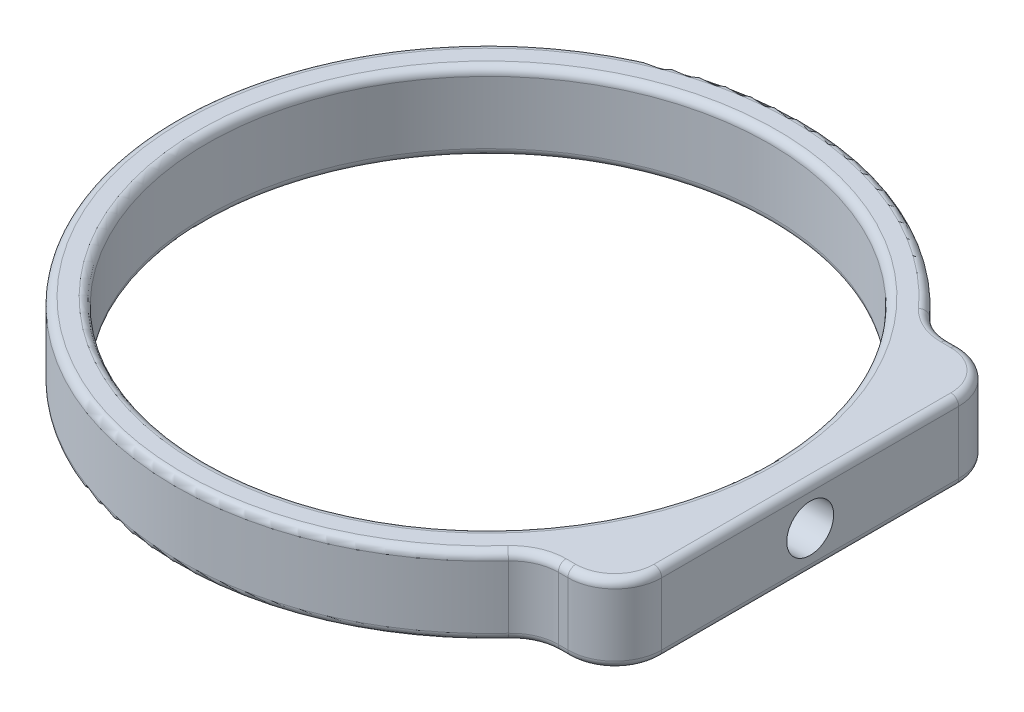
ISO-10303-21;
HEADER;
FILE_DESCRIPTION(('STEP AP214'),'2;1');
FILE_NAME('part.step','',(''),(''),'','','');
FILE_SCHEMA(('AUTOMOTIVE_DESIGN { 1 0 10303 214 1 1 1 1 }'));
ENDSEC;
DATA;
#1=APPLICATION_CONTEXT('core data for automotive mechanical design processes');
#2=APPLICATION_PROTOCOL_DEFINITION('international standard','automotive_design',2000,#1);
#3=PRODUCT_CONTEXT('',#1,'mechanical');
#4=PRODUCT('Part','Part','',(#3));
#5=PRODUCT_RELATED_PRODUCT_CATEGORY('part','',(#4));
#6=PRODUCT_DEFINITION_FORMATION('','',#4);
#7=PRODUCT_DEFINITION_CONTEXT('part definition',#1,'design');
#8=PRODUCT_DEFINITION('design','',#6,#7);
#9=PRODUCT_DEFINITION_SHAPE('','',#8);
#10=(LENGTH_UNIT() NAMED_UNIT(*) SI_UNIT(.MILLI.,.METRE.));
#11=(NAMED_UNIT(*) PLANE_ANGLE_UNIT() SI_UNIT($,.RADIAN.));
#12=(NAMED_UNIT(*) SI_UNIT($,.STERADIAN.) SOLID_ANGLE_UNIT());
#13=UNCERTAINTY_MEASURE_WITH_UNIT(LENGTH_MEASURE(1.E-05),#10,'distance_accuracy_value','');
#14=(GEOMETRIC_REPRESENTATION_CONTEXT(3) GLOBAL_UNCERTAINTY_ASSIGNED_CONTEXT((#13)) GLOBAL_UNIT_ASSIGNED_CONTEXT((#10,
#11,#12)) REPRESENTATION_CONTEXT('',''));
#15=CARTESIAN_POINT('',(0.,0.,0.));
#16=DIRECTION('',(0.,0.,1.));
#17=DIRECTION('',(1.,0.,0.));
#18=AXIS2_PLACEMENT_3D('',#15,#16,#17);
#19=CARTESIAN_POINT('',(0.,2.5,0.));
#20=DIRECTION('',(0.,1.,0.));
#21=DIRECTION('',(0.,0.,1.));
#22=AXIS2_PLACEMENT_3D('',#19,#20,#21);
#23=PLANE('',#22);
#24=CARTESIAN_POINT('',(0.,2.5,0.));
#25=DIRECTION('',(0.,1.,0.));
#26=DIRECTION('',(0.,0.,1.));
#27=AXIS2_PLACEMENT_3D('',#24,#25,#26);
#28=CIRCLE('',#27,9.25);
#29=CARTESIAN_POINT('',(0.,2.5,9.25));
#30=VERTEX_POINT('',#29);
#31=EDGE_CURVE('E11',#30,#30,#28,.F.);
#32=ORIENTED_EDGE('',*,*,#31,.T.);
#33=EDGE_LOOP('',(#32));
#34=FACE_BOUND('',#33,.T.);
#35=CARTESIAN_POINT('',(0.,2.5,0.));
#36=DIRECTION('',(0.,1.,0.));
#37=DIRECTION('',(0.,0.,1.));
#38=AXIS2_PLACEMENT_3D('',#35,#36,#37);
#39=CIRCLE('',#38,9.75);
#40=CARTESIAN_POINT('',(7.20340405707272,2.5,-6.57065217391304));
#41=VERTEX_POINT('',#40);
#42=CARTESIAN_POINT('',(7.20340405707272,2.5,6.57065217391304));
#43=VERTEX_POINT('',#42);
#44=EDGE_CURVE('E51',#41,#43,#39,.T.);
#45=ORIENTED_EDGE('',*,*,#44,.T.);
#46=CARTESIAN_POINT('',(8.49632273398321,2.5,7.75));
#47=DIRECTION('',(0.,1.,0.));
#48=DIRECTION('',(0.,0.,1.));
#49=AXIS2_PLACEMENT_3D('',#46,#47,#48);
#50=CIRCLE('',#49,1.75);
#51=CARTESIAN_POINT('',(8.49632273398321,2.5,6.));
#52=VERTEX_POINT('',#51);
#53=EDGE_CURVE('E43',#43,#52,#50,.F.);
#54=ORIENTED_EDGE('',*,*,#53,.T.);
#55=DIRECTION('',(1.,0.,0.));
#56=VECTOR('',#55,1.);
#57=CARTESIAN_POINT('',(8.806247497998,2.5,6.));
#58=LINE('',#57,#56);
#59=CARTESIAN_POINT('',(8.806247497998,2.5,6.));
#60=VERTEX_POINT('',#59);
#61=EDGE_CURVE('E221',#52,#60,#58,.T.);
#62=ORIENTED_EDGE('',*,*,#61,.T.);
#63=CARTESIAN_POINT('',(8.806247497998,2.5,4.75));
#64=DIRECTION('',(0.,1.,0.));
#65=DIRECTION('',(0.,0.,1.));
#66=AXIS2_PLACEMENT_3D('',#63,#64,#65);
#67=CIRCLE('',#66,1.25);
#68=CARTESIAN_POINT('',(10.056247497998,2.5,4.75));
#69=VERTEX_POINT('',#68);
#70=EDGE_CURVE('E223',#60,#69,#67,.T.);
#71=ORIENTED_EDGE('',*,*,#70,.T.);
#72=DIRECTION('',(0.,0.,-1.));
#73=VECTOR('',#72,1.);
#74=CARTESIAN_POINT('',(10.056247497998,2.5,-4.75));
#75=LINE('',#74,#73);
#76=CARTESIAN_POINT('',(10.056247497998,2.5,-4.75));
#77=VERTEX_POINT('',#76);
#78=EDGE_CURVE('E225',#69,#77,#75,.T.);
#79=ORIENTED_EDGE('',*,*,#78,.T.);
#80=CARTESIAN_POINT('',(8.806247497998,2.5,-4.75));
#81=DIRECTION('',(0.,1.,0.));
#82=DIRECTION('',(0.,0.,1.));
#83=AXIS2_PLACEMENT_3D('',#80,#81,#82);
#84=CIRCLE('',#83,1.25);
#85=CARTESIAN_POINT('',(8.806247497998,2.5,-6.));
#86=VERTEX_POINT('',#85);
#87=EDGE_CURVE('E227',#77,#86,#84,.T.);
#88=ORIENTED_EDGE('',*,*,#87,.T.);
#89=DIRECTION('',(-1.,0.,0.));
#90=VECTOR('',#89,1.);
#91=CARTESIAN_POINT('',(8.49632273398321,2.5,-6.));
#92=LINE('',#91,#90);
#93=CARTESIAN_POINT('',(8.49632273398321,2.5,-6.));
#94=VERTEX_POINT('',#93);
#95=EDGE_CURVE('E229',#86,#94,#92,.T.);
#96=ORIENTED_EDGE('',*,*,#95,.T.);
#97=CARTESIAN_POINT('',(8.49632273398321,2.5,-7.75));
#98=DIRECTION('',(0.,1.,0.));
#99=DIRECTION('',(0.,0.,1.));
#100=AXIS2_PLACEMENT_3D('',#97,#98,#99);
#101=CIRCLE('',#100,1.75);
#102=EDGE_CURVE('E56',#94,#41,#101,.F.);
#103=ORIENTED_EDGE('',*,*,#102,.T.);
#104=EDGE_LOOP('',(#45,#54,#62,#71,#79,#88,#96,#103));
#105=FACE_BOUND('',#104,.T.);
#106=ADVANCED_FACE('F34',(#34,#105),#23,.T.);
#107=CARTESIAN_POINT('',(0.,0.,0.));
#108=DIRECTION('',(0.,1.,0.));
#109=DIRECTION('',(0.,0.,1.));
#110=AXIS2_PLACEMENT_3D('',#107,#108,#109);
#111=PLANE('',#110);
#112=CARTESIAN_POINT('',(0.,0.,0.));
#113=DIRECTION('',(0.,1.,0.));
#114=DIRECTION('',(0.,0.,1.));
#115=AXIS2_PLACEMENT_3D('',#112,#113,#114);
#116=CIRCLE('',#115,9.25);
#117=CARTESIAN_POINT('',(0.,0.,9.25));
#118=VERTEX_POINT('',#117);
#119=EDGE_CURVE('E175',#118,#118,#116,.T.);
#120=ORIENTED_EDGE('',*,*,#119,.T.);
#121=EDGE_LOOP('',(#120));
#122=FACE_BOUND('',#121,.T.);
#123=DIRECTION('',(-1.,0.,0.));
#124=VECTOR('',#123,1.);
#125=CARTESIAN_POINT('',(0.,0.,-6.));
#126=LINE('',#125,#124);
#127=CARTESIAN_POINT('',(8.49632273398321,0.,-6.));
#128=VERTEX_POINT('',#127);
#129=CARTESIAN_POINT('',(8.806247497998,0.,-6.));
#130=VERTEX_POINT('',#129);
#131=EDGE_CURVE('E173',#128,#130,#126,.F.);
#132=ORIENTED_EDGE('',*,*,#131,.T.);
#133=CARTESIAN_POINT('',(8.806247497998,0.,-4.75));
#134=DIRECTION('',(0.,1.,0.));
#135=DIRECTION('',(0.,0.,1.));
#136=AXIS2_PLACEMENT_3D('',#133,#134,#135);
#137=CIRCLE('',#136,1.25);
#138=CARTESIAN_POINT('',(10.056247497998,0.,-4.75));
#139=VERTEX_POINT('',#138);
#140=EDGE_CURVE('E154',#130,#139,#137,.F.);
#141=ORIENTED_EDGE('',*,*,#140,.T.);
#142=DIRECTION('',(0.,0.,-1.));
#143=VECTOR('',#142,1.);
#144=CARTESIAN_POINT('',(10.056247497998,0.,0.));
#145=LINE('',#144,#143);
#146=CARTESIAN_POINT('',(10.056247497998,0.,4.75));
#147=VERTEX_POINT('',#146);
#148=EDGE_CURVE('E162',#139,#147,#145,.F.);
#149=ORIENTED_EDGE('',*,*,#148,.T.);
#150=CARTESIAN_POINT('',(8.806247497998,0.,4.75));
#151=DIRECTION('',(0.,1.,0.));
#152=DIRECTION('',(0.,0.,1.));
#153=AXIS2_PLACEMENT_3D('',#150,#151,#152);
#154=CIRCLE('',#153,1.25);
#155=CARTESIAN_POINT('',(8.806247497998,0.,6.));
#156=VERTEX_POINT('',#155);
#157=EDGE_CURVE('E168',#147,#156,#154,.F.);
#158=ORIENTED_EDGE('',*,*,#157,.T.);
#159=DIRECTION('',(1.,0.,0.));
#160=VECTOR('',#159,1.);
#161=CARTESIAN_POINT('',(0.,0.,6.));
#162=LINE('',#161,#160);
#163=CARTESIAN_POINT('',(8.49632273398321,0.,6.));
#164=VERTEX_POINT('',#163);
#165=EDGE_CURVE('E324',#156,#164,#162,.F.);
#166=ORIENTED_EDGE('',*,*,#165,.T.);
#167=CARTESIAN_POINT('',(8.49632273398321,0.,7.75));
#168=DIRECTION('',(0.,1.,0.));
#169=DIRECTION('',(0.,0.,1.));
#170=AXIS2_PLACEMENT_3D('',#167,#168,#169);
#171=CIRCLE('',#170,1.75);
#172=CARTESIAN_POINT('',(7.20340405707272,0.,6.57065217391304));
#173=VERTEX_POINT('',#172);
#174=EDGE_CURVE('E326',#164,#173,#171,.T.);
#175=ORIENTED_EDGE('',*,*,#174,.T.);
#176=CARTESIAN_POINT('',(0.,0.,0.));
#177=DIRECTION('',(0.,1.,0.));
#178=DIRECTION('',(0.,0.,1.));
#179=AXIS2_PLACEMENT_3D('',#176,#177,#178);
#180=CIRCLE('',#179,9.75);
#181=CARTESIAN_POINT('',(7.20340405707272,0.,-6.57065217391304));
#182=VERTEX_POINT('',#181);
#183=EDGE_CURVE('E328',#173,#182,#180,.F.);
#184=ORIENTED_EDGE('',*,*,#183,.T.);
#185=CARTESIAN_POINT('',(8.49632273398321,0.,-7.75));
#186=DIRECTION('',(0.,1.,0.));
#187=DIRECTION('',(0.,0.,1.));
#188=AXIS2_PLACEMENT_3D('',#185,#186,#187);
#189=CIRCLE('',#188,1.75);
#190=EDGE_CURVE('E180',#182,#128,#189,.T.);
#191=ORIENTED_EDGE('',*,*,#190,.T.);
#192=EDGE_LOOP('',(#132,#141,#149,#158,#166,#175,#184,#191));
#193=FACE_BOUND('',#192,.T.);
#194=ADVANCED_FACE('F171',(#122,#193),#111,.F.);
#195=CARTESIAN_POINT('',(0.,2.5,0.));
#196=DIRECTION('',(0.,-1.,0.));
#197=DIRECTION('',(0.,0.,-1.));
#198=AXIS2_PLACEMENT_3D('',#195,#196,#197);
#199=CYLINDRICAL_SURFACE('',#198,10.);
#200=DIRECTION('',(0.,-1.,0.));
#201=VECTOR('',#200,1.);
#202=CARTESIAN_POINT('',(7.38810672520279,2.5,-6.73913043478261));
#203=LINE('',#202,#201);
#204=CARTESIAN_POINT('',(7.38810672520279,2.25,-6.73913043478261));
#205=VERTEX_POINT('',#204);
#206=CARTESIAN_POINT('',(7.38810672520279,0.25,-6.73913043478261));
#207=VERTEX_POINT('',#206);
#208=EDGE_CURVE('E313',#205,#207,#203,.T.);
#209=ORIENTED_EDGE('',*,*,#208,.T.);
#210=CARTESIAN_POINT('',(0.,0.25,0.));
#211=DIRECTION('',(0.,1.,0.));
#212=DIRECTION('',(0.,0.,1.));
#213=AXIS2_PLACEMENT_3D('',#210,#211,#212);
#214=CIRCLE('',#213,10.);
#215=CARTESIAN_POINT('',(7.38810672520279,0.25,6.73913043478261));
#216=VERTEX_POINT('',#215);
#217=EDGE_CURVE('E202',#207,#216,#214,.T.);
#218=ORIENTED_EDGE('',*,*,#217,.T.);
#219=DIRECTION('',(0.,-1.,0.));
#220=VECTOR('',#219,1.);
#221=CARTESIAN_POINT('',(7.38810672520279,2.5,6.73913043478261));
#222=LINE('',#221,#220);
#223=CARTESIAN_POINT('',(7.38810672520279,2.25,6.73913043478261));
#224=VERTEX_POINT('',#223);
#225=EDGE_CURVE('E316',#216,#224,#222,.F.);
#226=ORIENTED_EDGE('',*,*,#225,.T.);
#227=CARTESIAN_POINT('',(0.,2.25,0.));
#228=DIRECTION('',(0.,1.,0.));
#229=DIRECTION('',(0.,0.,1.));
#230=AXIS2_PLACEMENT_3D('',#227,#228,#229);
#231=CIRCLE('',#230,10.);
#232=EDGE_CURVE('E200',#224,#205,#231,.F.);
#233=ORIENTED_EDGE('',*,*,#232,.T.);
#234=EDGE_LOOP('',(#209,#218,#226,#233));
#235=FACE_BOUND('',#234,.T.);
#236=ADVANCED_FACE('F384',(#235),#199,.T.);
#237=CARTESIAN_POINT('',(10.306247497998,2.5,6.25));
#238=DIRECTION('',(0.,0.,-1.));
#239=DIRECTION('',(-1.,0.,0.));
#240=AXIS2_PLACEMENT_3D('',#237,#238,#239);
#241=PLANE('',#240);
#242=DIRECTION('',(0.,1.,0.));
#243=VECTOR('',#242,1.);
#244=CARTESIAN_POINT('',(8.49632273398321,0.,6.25));
#245=LINE('',#244,#243);
#246=CARTESIAN_POINT('',(8.49632273398321,2.25,6.25));
#247=VERTEX_POINT('',#246);
#248=CARTESIAN_POINT('',(8.49632273398321,0.25,6.25));
#249=VERTEX_POINT('',#248);
#250=EDGE_CURVE('E297',#247,#249,#245,.F.);
#251=ORIENTED_EDGE('',*,*,#250,.T.);
#252=DIRECTION('',(1.,0.,0.));
#253=VECTOR('',#252,1.);
#254=CARTESIAN_POINT('',(10.306247497998,0.25,6.25));
#255=LINE('',#254,#253);
#256=CARTESIAN_POINT('',(8.806247497998,0.25,6.25));
#257=VERTEX_POINT('',#256);
#258=EDGE_CURVE('E211',#249,#257,#255,.T.);
#259=ORIENTED_EDGE('',*,*,#258,.T.);
#260=DIRECTION('',(0.,-1.,0.));
#261=VECTOR('',#260,1.);
#262=CARTESIAN_POINT('',(8.806247497998,2.5,6.25));
#263=LINE('',#262,#261);
#264=CARTESIAN_POINT('',(8.806247497998,2.25,6.25));
#265=VERTEX_POINT('',#264);
#266=EDGE_CURVE('E310',#257,#265,#263,.F.);
#267=ORIENTED_EDGE('',*,*,#266,.T.);
#268=DIRECTION('',(1.,0.,0.));
#269=VECTOR('',#268,1.);
#270=CARTESIAN_POINT('',(8.49632273398321,2.25,6.25));
#271=LINE('',#270,#269);
#272=EDGE_CURVE('E209',#265,#247,#271,.F.);
#273=ORIENTED_EDGE('',*,*,#272,.T.);
#274=EDGE_LOOP('',(#251,#259,#267,#273));
#275=FACE_BOUND('',#274,.T.);
#276=ADVANCED_FACE('F368',(#275),#241,.F.);
#277=CARTESIAN_POINT('',(10.306247497998,2.5,-6.25));
#278=DIRECTION('',(-1.,0.,0.));
#279=DIRECTION('',(0.,0.,1.));
#280=AXIS2_PLACEMENT_3D('',#277,#278,#279);
#281=PLANE('',#280);
#282=CARTESIAN_POINT('',(10.306247497998,1.25,0.));
#283=DIRECTION('',(1.,0.,0.));
#284=DIRECTION('',(0.,0.,-1.));
#285=AXIS2_PLACEMENT_3D('',#282,#283,#284);
#286=CIRCLE('',#285,0.75);
#287=CARTESIAN_POINT('',(10.306247497998,1.25,-0.749999999999999));
#288=VERTEX_POINT('',#287);
#289=EDGE_CURVE('E251',#288,#288,#286,.T.);
#290=ORIENTED_EDGE('',*,*,#289,.F.);
#291=EDGE_LOOP('',(#290));
#292=FACE_BOUND('',#291,.T.);
#293=DIRECTION('',(0.,-1.,0.));
#294=VECTOR('',#293,1.);
#295=CARTESIAN_POINT('',(10.306247497998,2.5,4.75));
#296=LINE('',#295,#294);
#297=CARTESIAN_POINT('',(10.306247497998,2.25,4.75));
#298=VERTEX_POINT('',#297);
#299=CARTESIAN_POINT('',(10.306247497998,0.25,4.75));
#300=VERTEX_POINT('',#299);
#301=EDGE_CURVE('E294',#298,#300,#296,.T.);
#302=ORIENTED_EDGE('',*,*,#301,.T.);
#303=DIRECTION('',(0.,0.,-1.));
#304=VECTOR('',#303,1.);
#305=CARTESIAN_POINT('',(10.306247497998,0.25,-6.25));
#306=LINE('',#305,#304);
#307=CARTESIAN_POINT('',(10.306247497998,0.25,-4.75));
#308=VERTEX_POINT('',#307);
#309=EDGE_CURVE('E219',#300,#308,#306,.T.);
#310=ORIENTED_EDGE('',*,*,#309,.T.);
#311=DIRECTION('',(0.,-1.,0.));
#312=VECTOR('',#311,1.);
#313=CARTESIAN_POINT('',(10.306247497998,2.5,-4.75));
#314=LINE('',#313,#312);
#315=CARTESIAN_POINT('',(10.306247497998,2.25,-4.75));
#316=VERTEX_POINT('',#315);
#317=EDGE_CURVE('E288',#308,#316,#314,.F.);
#318=ORIENTED_EDGE('',*,*,#317,.T.);
#319=DIRECTION('',(0.,0.,-1.));
#320=VECTOR('',#319,1.);
#321=CARTESIAN_POINT('',(10.306247497998,2.25,4.75));
#322=LINE('',#321,#320);
#323=EDGE_CURVE('E217',#316,#298,#322,.F.);
#324=ORIENTED_EDGE('',*,*,#323,.T.);
#325=EDGE_LOOP('',(#302,#310,#318,#324));
#326=FACE_BOUND('',#325,.T.);
#327=ADVANCED_FACE('F292',(#292,#326),#281,.F.);
#328=CARTESIAN_POINT('',(7.806247497998,2.5,-6.25));
#329=DIRECTION('',(0.,0.,1.));
#330=DIRECTION('',(1.,0.,0.));
#331=AXIS2_PLACEMENT_3D('',#328,#329,#330);
#332=PLANE('',#331);
#333=DIRECTION('',(0.,-1.,0.));
#334=VECTOR('',#333,1.);
#335=CARTESIAN_POINT('',(8.806247497998,2.5,-6.25));
#336=LINE('',#335,#334);
#337=CARTESIAN_POINT('',(8.806247497998,2.25,-6.25));
#338=VERTEX_POINT('',#337);
#339=CARTESIAN_POINT('',(8.806247497998,0.25,-6.25));
#340=VERTEX_POINT('',#339);
#341=EDGE_CURVE('E169',#338,#340,#336,.T.);
#342=ORIENTED_EDGE('',*,*,#341,.T.);
#343=DIRECTION('',(-1.,0.,0.));
#344=VECTOR('',#343,1.);
#345=CARTESIAN_POINT('',(7.806247497998,0.25,-6.25));
#346=LINE('',#345,#344);
#347=CARTESIAN_POINT('',(8.49632273398321,0.25,-6.25));
#348=VERTEX_POINT('',#347);
#349=EDGE_CURVE('E194',#340,#348,#346,.T.);
#350=ORIENTED_EDGE('',*,*,#349,.T.);
#351=DIRECTION('',(0.,1.,0.));
#352=VECTOR('',#351,1.);
#353=CARTESIAN_POINT('',(8.49632273398321,2.5,-6.25));
#354=LINE('',#353,#352);
#355=CARTESIAN_POINT('',(8.49632273398321,2.25,-6.25));
#356=VERTEX_POINT('',#355);
#357=EDGE_CURVE('E319',#348,#356,#354,.T.);
#358=ORIENTED_EDGE('',*,*,#357,.T.);
#359=DIRECTION('',(-1.,0.,0.));
#360=VECTOR('',#359,1.);
#361=CARTESIAN_POINT('',(8.806247497998,2.25,-6.25));
#362=LINE('',#361,#360);
#363=EDGE_CURVE('E192',#356,#338,#362,.F.);
#364=ORIENTED_EDGE('',*,*,#363,.T.);
#365=EDGE_LOOP('',(#342,#350,#358,#364));
#366=FACE_BOUND('',#365,.T.);
#367=ADVANCED_FACE('F341',(#366),#332,.F.);
#368=CARTESIAN_POINT('',(0.,2.5,0.));
#369=DIRECTION('',(0.,-1.,0.));
#370=DIRECTION('',(0.,0.,-1.));
#371=AXIS2_PLACEMENT_3D('',#368,#369,#370);
#372=CYLINDRICAL_SURFACE('',#371,9.);
#373=CARTESIAN_POINT('',(0.,0.25,0.));
#374=DIRECTION('',(0.,1.,0.));
#375=DIRECTION('',(0.,0.,1.));
#376=AXIS2_PLACEMENT_3D('',#373,#374,#375);
#377=CIRCLE('',#376,9.);
#378=CARTESIAN_POINT('',(0.,0.25,9.));
#379=VERTEX_POINT('',#378);
#380=EDGE_CURVE('E186',#379,#379,#377,.F.);
#381=ORIENTED_EDGE('',*,*,#380,.T.);
#382=EDGE_LOOP('',(#381));
#383=FACE_BOUND('',#382,.T.);
#384=CARTESIAN_POINT('',(0.,2.25,0.));
#385=DIRECTION('',(0.,1.,0.));
#386=DIRECTION('',(0.,0.,1.));
#387=AXIS2_PLACEMENT_3D('',#384,#385,#386);
#388=CIRCLE('',#387,9.);
#389=CARTESIAN_POINT('',(0.,2.25,9.));
#390=VERTEX_POINT('',#389);
#391=EDGE_CURVE('E178',#390,#390,#388,.T.);
#392=ORIENTED_EDGE('',*,*,#391,.T.);
#393=EDGE_LOOP('',(#392));
#394=FACE_BOUND('',#393,.T.);
#395=CARTESIAN_POINT('',(8.96869555732605,1.25,-0.749999999999999));
#396=CARTESIAN_POINT('',(8.96869597206271,1.2920492815928,-0.749998163122784));
#397=CARTESIAN_POINT('',(8.96899445986964,1.33412718961826,-0.746451818969865));
#398=CARTESIAN_POINT('',(8.97015614811949,1.41711876525757,-0.732356984305715));
#399=CARTESIAN_POINT('',(8.97101998841349,1.45803105884571,-0.721800559771241));
#400=CARTESIAN_POINT('',(8.97321386622007,1.537477397094,-0.693992988553144));
#401=CARTESIAN_POINT('',(8.97454363939202,1.57601277571622,-0.676745637281645));
#402=CARTESIAN_POINT('',(8.97751922026213,1.64963239640744,-0.636052551364092));
#403=CARTESIAN_POINT('',(8.97916496037526,1.68471737409128,-0.612608141859518));
#404=CARTESIAN_POINT('',(8.98259178584613,1.75053950229998,-0.560121402343525));
#405=CARTESIAN_POINT('',(8.98437317076771,1.78126657389723,-0.531066451051407));
#406=CARTESIAN_POINT('',(8.9878678245808,1.83741407467852,-0.46821009050707));
#407=CARTESIAN_POINT('',(8.98958109049367,1.86283427201569,-0.434408473990257));
#408=CARTESIAN_POINT('',(8.99274930380637,1.90767996099214,-0.362958183981592));
#409=CARTESIAN_POINT('',(8.9942038741496,1.92709673238609,-0.325304019094393));
#410=CARTESIAN_POINT('',(8.99668757829216,1.95932861833887,-0.247255800374071));
#411=CARTESIAN_POINT('',(8.99771671953798,1.97214384844865,-0.20686179451212));
#412=CARTESIAN_POINT('',(8.99923151589502,1.99077986289203,-0.124580846960857));
#413=CARTESIAN_POINT('',(8.99971843784964,1.99661695333959,-0.0826976221742401));
#414=CARTESIAN_POINT('',(9.00009822550669,2.00118140238844,0.00145671141736552));
#415=CARTESIAN_POINT('',(8.99999110225621,1.99990889320243,0.0437278129946625));
#416=CARTESIAN_POINT('',(8.99919591479093,1.99030360086547,0.127347413639112));
#417=CARTESIAN_POINT('',(8.99850929341896,1.98198835264685,0.16869794255435));
#418=CARTESIAN_POINT('',(8.99663399890965,1.95856088677843,0.249414349530185));
#419=CARTESIAN_POINT('',(8.99544532099547,1.94344860445809,0.288780208703628));
#420=CARTESIAN_POINT('',(8.9926971593422,1.90683650966107,0.364465620477643));
#421=CARTESIAN_POINT('',(8.99113722019022,1.88532884405093,0.400781356994232));
#422=CARTESIAN_POINT('',(8.98782183951939,1.83654220881604,0.469294001908028));
#423=CARTESIAN_POINT('',(8.98606639403529,1.80926312212579,0.501490826737404));
#424=CARTESIAN_POINT('',(8.98255098560451,1.74960917003356,0.560954223586423));
#425=CARTESIAN_POINT('',(8.98079102514498,1.7172190678859,0.588205512498772));
#426=CARTESIAN_POINT('',(8.97747031329284,1.64831562116275,0.63688619919203));
#427=CARTESIAN_POINT('',(8.97590956206445,1.61180227318837,0.658315592173738));
#428=CARTESIAN_POINT('',(8.97316369572739,1.53567808417115,0.694743603444939));
#429=CARTESIAN_POINT('',(8.97197862695507,1.49606686178983,0.709741428551026));
#430=CARTESIAN_POINT('',(8.97011919959986,1.41487646146175,0.732869255271383));
#431=CARTESIAN_POINT('',(8.96944483028011,1.37329732490765,0.740999401271103));
#432=CARTESIAN_POINT('',(8.96868489672401,1.28948511008353,0.750141737184464));
#433=CARTESIAN_POINT('',(8.9685975695118,1.24725437191483,0.751175239588416));
#434=CARTESIAN_POINT('',(8.96901695410363,1.16322024226278,0.746150778783617));
#435=CARTESIAN_POINT('',(8.96952366036689,1.12141684679709,0.740092881719117));
#436=CARTESIAN_POINT('',(8.9710724110856,1.03948523315034,0.721075350931861));
#437=CARTESIAN_POINT('',(8.97211368399353,0.999354690527679,0.708125663242089));
#438=CARTESIAN_POINT('',(8.9746136023471,0.921835938377194,0.67570225667238));
#439=CARTESIAN_POINT('',(8.97607225448968,0.884447772863546,0.656228433110301));
#440=CARTESIAN_POINT('',(8.97924685097389,0.813377560835553,0.611255615984212));
#441=CARTESIAN_POINT('',(8.98096339825056,0.779704528701184,0.585742420263778));
#442=CARTESIAN_POINT('',(8.98445833330335,0.717111544319874,0.529435596311632));
#443=CARTESIAN_POINT('',(8.98623672214316,0.688191673878261,0.498641877216951));
#444=CARTESIAN_POINT('',(8.9896602083162,0.63585319567247,0.432556029683809));
#445=CARTESIAN_POINT('',(8.99130496348556,0.612448435247657,0.397252914307373));
#446=CARTESIAN_POINT('',(8.99427092903293,0.571899564826593,0.323205144910804));
#447=CARTESIAN_POINT('',(8.99559214264404,0.554755392268467,0.284460525286333));
#448=CARTESIAN_POINT('',(8.99776058414512,0.527238138187944,0.204679184075279));
#449=CARTESIAN_POINT('',(8.99860841126374,0.516856493640621,0.163645432890455));
#450=CARTESIAN_POINT('',(8.99973698497373,0.50313100568443,0.0804098842997246));
#451=CARTESIAN_POINT('',(9.00001774229903,0.499787029061319,0.038208109018372));
#452=CARTESIAN_POINT('',(8.99998055905035,0.500233354700732,-0.0460290362969258));
#453=CARTESIAN_POINT('',(8.99966442948514,0.504002076378906,-0.088064523158539));
#454=CARTESIAN_POINT('',(8.99847257546657,0.518521815883653,-0.170903334045999));
#455=CARTESIAN_POINT('',(8.99759685025315,0.529272843193778,-0.21170665639821));
#456=CARTESIAN_POINT('',(8.99538406277951,0.557446527591775,-0.290924284836563));
#457=CARTESIAN_POINT('',(8.99404702732659,0.574868797012208,-0.329338729590194));
#458=CARTESIAN_POINT('',(8.99106119970594,0.615887934048265,-0.402700929674266));
#459=CARTESIAN_POINT('',(8.9894124124684,0.639484704019395,-0.437648739814542));
#460=CARTESIAN_POINT('',(8.98598218876223,0.692264011136815,-0.503196067069093));
#461=CARTESIAN_POINT('',(8.98420038220112,0.721462516509911,-0.53378270698846));
#462=CARTESIAN_POINT('',(8.9807080873516,0.784587626544471,-0.589633369919657));
#463=CARTESIAN_POINT('',(8.97899761643983,0.81851537456217,-0.614896102086172));
#464=CARTESIAN_POINT('',(8.97583818306508,0.890201750525707,-0.659416034234141));
#465=CARTESIAN_POINT('',(8.97438971661155,0.927967437500925,-0.678661892593849));
#466=CARTESIAN_POINT('',(8.97192434703945,1.00618057755096,-0.710514675700345));
#467=CARTESIAN_POINT('',(8.97090694801725,1.04662488681292,-0.723129233197099));
#468=CARTESIAN_POINT('',(8.96968056141048,1.11442316317039,-0.738148573504564));
#469=CARTESIAN_POINT('',(8.9693128829179,1.14134108958392,-0.742586950543826));
#470=CARTESIAN_POINT('',(8.96882024679224,1.19550200238114,-0.748513255129994));
#471=CARTESIAN_POINT('',(8.96869528850689,1.2227449878911,-0.750001190605613));
#472=CARTESIAN_POINT('',(8.96869555732605,1.25,-0.749999999999999));
#473=B_SPLINE_CURVE_WITH_KNOTS('',3,(#395,#396,#397,#398,#399,#400,#401,#402,#403,#404,#405,
#406,#407,#408,#409,#410,#411,#412,#413,#414,#415,#416,#417,#418,#419,#420,#421,#422,#423,#424,
#425,#426,#427,#428,#429,#430,#431,#432,#433,#434,#435,#436,#437,#438,#439,#440,#441,#442,#443,
#444,#445,#446,#447,#448,#449,#450,#451,#452,#453,#454,#455,#456,#457,#458,#459,#460,#461,#462,
#463,#464,#465,#466,#467,#468,#469,#470,#471,#472),.UNSPECIFIED.,.T.,.F.,(4,2,2,2,2,2,2,2,2,2,2,
2,2,2,2,2,2,2,2,2,2,2,2,2,2,2,2,2,2,2,2,2,2,2,2,2,2,2,4),(0.,0.126048331537946,
0.252239568537879,0.378359328282894,0.504452141126868,0.630831983918811,0.757217346842256,
0.883785436953541,1.01035131158833,1.13662085266517,1.26288804559578,1.38884178093512,
1.51479671468982,1.64090695650754,1.76701975654686,1.89351588017104,2.0200121080703,
2.1465239318361,2.27303309576282,2.3991621632243,2.52529005424011,2.65123641277355,
2.77718479225909,2.90343234632254,3.02968207296963,3.15624548802738,3.28280763830597,
3.40920921660753,3.53560840226395,3.66162469753046,3.787641163956,3.91365030864622,
4.03965746072904,4.1660292924277,4.29243172933036,4.41907101404038,4.54556421365538,
4.627264968207,4.70896550320405),.UNSPECIFIED.);
#474=CARTESIAN_POINT('',(8.96869555732605,1.25,-0.749999999999999));
#475=VERTEX_POINT('',#474);
#476=EDGE_CURVE('E295',#475,#475,#473,.T.);
#477=ORIENTED_EDGE('',*,*,#476,.T.);
#478=EDGE_LOOP('',(#477));
#479=FACE_BOUND('',#478,.T.);
#480=ADVANCED_FACE('F401',(#383,#394,#479),#372,.F.);
#481=CARTESIAN_POINT('',(-10.001,1.25,0.));
#482=DIRECTION('',(1.,0.,0.));
#483=DIRECTION('',(0.,0.,-1.));
#484=AXIS2_PLACEMENT_3D('',#481,#482,#483);
#485=CYLINDRICAL_SURFACE('',#484,0.75);
#486=ORIENTED_EDGE('',*,*,#289,.T.);
#487=EDGE_LOOP('',(#486));
#488=FACE_BOUND('',#487,.T.);
#489=ORIENTED_EDGE('',*,*,#476,.F.);
#490=EDGE_LOOP('',(#489));
#491=FACE_BOUND('',#490,.T.);
#492=ADVANCED_FACE('F412',(#488,#491),#485,.F.);
#493=CARTESIAN_POINT('',(8.806247497998,2.5,4.75));
#494=DIRECTION('',(0.,-1.,0.));
#495=DIRECTION('',(0.,0.,-1.));
#496=AXIS2_PLACEMENT_3D('',#493,#494,#495);
#497=CYLINDRICAL_SURFACE('',#496,1.5);
#498=ORIENTED_EDGE('',*,*,#266,.F.);
#499=CARTESIAN_POINT('',(8.806247497998,0.25,4.75));
#500=DIRECTION('',(0.,1.,0.));
#501=DIRECTION('',(0.,0.,1.));
#502=AXIS2_PLACEMENT_3D('',#499,#500,#501);
#503=CIRCLE('',#502,1.5);
#504=EDGE_CURVE('E215',#257,#300,#503,.T.);
#505=ORIENTED_EDGE('',*,*,#504,.T.);
#506=ORIENTED_EDGE('',*,*,#301,.F.);
#507=CARTESIAN_POINT('',(8.806247497998,2.25,4.75));
#508=DIRECTION('',(0.,1.,0.));
#509=DIRECTION('',(0.,0.,1.));
#510=AXIS2_PLACEMENT_3D('',#507,#508,#509);
#511=CIRCLE('',#510,1.5);
#512=EDGE_CURVE('E213',#298,#265,#511,.F.);
#513=ORIENTED_EDGE('',*,*,#512,.T.);
#514=EDGE_LOOP('',(#498,#505,#506,#513));
#515=FACE_BOUND('',#514,.T.);
#516=ADVANCED_FACE('F415',(#515),#497,.T.);
#517=CARTESIAN_POINT('',(8.49632273398321,2.5,7.75));
#518=DIRECTION('',(0.,-1.,0.));
#519=DIRECTION('',(0.,0.,-1.));
#520=AXIS2_PLACEMENT_3D('',#517,#518,#519);
#521=CYLINDRICAL_SURFACE('',#520,1.5);
#522=ORIENTED_EDGE('',*,*,#225,.F.);
#523=CARTESIAN_POINT('',(8.49632273398321,0.25,7.75));
#524=DIRECTION('',(0.,1.,0.));
#525=DIRECTION('',(0.,0.,1.));
#526=AXIS2_PLACEMENT_3D('',#523,#524,#525);
#527=CIRCLE('',#526,1.5);
#528=EDGE_CURVE('E207',#216,#249,#527,.F.);
#529=ORIENTED_EDGE('',*,*,#528,.T.);
#530=ORIENTED_EDGE('',*,*,#250,.F.);
#531=CARTESIAN_POINT('',(8.49632273398321,2.25,7.75));
#532=DIRECTION('',(0.,1.,0.));
#533=DIRECTION('',(0.,0.,1.));
#534=AXIS2_PLACEMENT_3D('',#531,#532,#533);
#535=CIRCLE('',#534,1.5);
#536=EDGE_CURVE('E204',#247,#224,#535,.T.);
#537=ORIENTED_EDGE('',*,*,#536,.T.);
#538=EDGE_LOOP('',(#522,#529,#530,#537));
#539=FACE_BOUND('',#538,.T.);
#540=ADVANCED_FACE('F373',(#539),#521,.F.);
#541=CARTESIAN_POINT('',(8.806247497998,2.5,-4.75));
#542=DIRECTION('',(0.,-1.,0.));
#543=DIRECTION('',(0.,0.,-1.));
#544=AXIS2_PLACEMENT_3D('',#541,#542,#543);
#545=CYLINDRICAL_SURFACE('',#544,1.5);
#546=ORIENTED_EDGE('',*,*,#317,.F.);
#547=CARTESIAN_POINT('',(8.806247497998,0.25,-4.75));
#548=DIRECTION('',(0.,1.,0.));
#549=DIRECTION('',(0.,0.,1.));
#550=AXIS2_PLACEMENT_3D('',#547,#548,#549);
#551=CIRCLE('',#550,1.5);
#552=EDGE_CURVE('E156',#308,#340,#551,.T.);
#553=ORIENTED_EDGE('',*,*,#552,.T.);
#554=ORIENTED_EDGE('',*,*,#341,.F.);
#555=CARTESIAN_POINT('',(8.806247497998,2.25,-4.75));
#556=DIRECTION('',(0.,1.,0.));
#557=DIRECTION('',(0.,0.,1.));
#558=AXIS2_PLACEMENT_3D('',#555,#556,#557);
#559=CIRCLE('',#558,1.5);
#560=EDGE_CURVE('E189',#338,#316,#559,.F.);
#561=ORIENTED_EDGE('',*,*,#560,.T.);
#562=EDGE_LOOP('',(#546,#553,#554,#561));
#563=FACE_BOUND('',#562,.T.);
#564=ADVANCED_FACE('F287',(#563),#545,.T.);
#565=CARTESIAN_POINT('',(8.49632273398321,2.5,-7.75));
#566=DIRECTION('',(0.,-1.,0.));
#567=DIRECTION('',(0.,0.,-1.));
#568=AXIS2_PLACEMENT_3D('',#565,#566,#567);
#569=CYLINDRICAL_SURFACE('',#568,1.5);
#570=ORIENTED_EDGE('',*,*,#357,.F.);
#571=CARTESIAN_POINT('',(8.49632273398321,0.25,-7.75));
#572=DIRECTION('',(0.,1.,0.));
#573=DIRECTION('',(0.,0.,1.));
#574=AXIS2_PLACEMENT_3D('',#571,#572,#573);
#575=CIRCLE('',#574,1.5);
#576=EDGE_CURVE('E198',#348,#207,#575,.F.);
#577=ORIENTED_EDGE('',*,*,#576,.T.);
#578=ORIENTED_EDGE('',*,*,#208,.F.);
#579=CARTESIAN_POINT('',(8.49632273398321,2.25,-7.75));
#580=DIRECTION('',(0.,1.,0.));
#581=DIRECTION('',(0.,0.,1.));
#582=AXIS2_PLACEMENT_3D('',#579,#580,#581);
#583=CIRCLE('',#582,1.5);
#584=EDGE_CURVE('E196',#205,#356,#583,.T.);
#585=ORIENTED_EDGE('',*,*,#584,.T.);
#586=EDGE_LOOP('',(#570,#577,#578,#585));
#587=FACE_BOUND('',#586,.T.);
#588=ADVANCED_FACE('F343',(#587),#569,.F.);
#589=CARTESIAN_POINT('',(0.,0.25,0.));
#590=DIRECTION('',(0.,1.,0.));
#591=DIRECTION('',(0.,0.,1.));
#592=AXIS2_PLACEMENT_3D('',#589,#590,#591);
#593=TOROIDAL_SURFACE('',#592,9.25,0.25);
#594=ORIENTED_EDGE('',*,*,#380,.F.);
#595=EDGE_LOOP('',(#594));
#596=FACE_BOUND('',#595,.T.);
#597=ORIENTED_EDGE('',*,*,#119,.F.);
#598=EDGE_LOOP('',(#597));
#599=FACE_BOUND('',#598,.T.);
#600=ADVANCED_FACE('F567',(#596,#599),#593,.T.);
#601=CARTESIAN_POINT('',(8.49632273398321,0.25,7.75));
#602=DIRECTION('',(0.,1.,0.));
#603=DIRECTION('',(0.,0.,1.));
#604=AXIS2_PLACEMENT_3D('',#601,#602,#603);
#605=TOROIDAL_SURFACE('',#604,1.75,0.25);
#606=CARTESIAN_POINT('',(8.49632273398321,0.25,6.));
#607=DIRECTION('',(1.,0.,0.));
#608=DIRECTION('',(0.,0.,-1.));
#609=AXIS2_PLACEMENT_3D('',#606,#607,#608);
#610=CIRCLE('',#609,0.25);
#611=EDGE_CURVE('E245',#249,#164,#610,.T.);
#612=ORIENTED_EDGE('',*,*,#611,.F.);
#613=ORIENTED_EDGE('',*,*,#528,.F.);
#614=CARTESIAN_POINT('',(7.20340405707272,0.25,6.57065217391304));
#615=DIRECTION('',(-0.673913043478261,0.,0.738810672520279));
#616=DIRECTION('',(0.738810672520279,0.,0.673913043478261));
#617=AXIS2_PLACEMENT_3D('',#614,#615,#616);
#618=CIRCLE('',#617,0.25);
#619=EDGE_CURVE('E248',#173,#216,#618,.T.);
#620=ORIENTED_EDGE('',*,*,#619,.F.);
#621=ORIENTED_EDGE('',*,*,#174,.F.);
#622=EDGE_LOOP('',(#612,#613,#620,#621));
#623=FACE_BOUND('',#622,.T.);
#624=ADVANCED_FACE('F377',(#623),#605,.T.);
#625=CARTESIAN_POINT('',(0.,0.25,0.));
#626=DIRECTION('',(0.,1.,0.));
#627=DIRECTION('',(0.,0.,1.));
#628=AXIS2_PLACEMENT_3D('',#625,#626,#627);
#629=TOROIDAL_SURFACE('',#628,9.75,0.25);
#630=ORIENTED_EDGE('',*,*,#619,.T.);
#631=ORIENTED_EDGE('',*,*,#217,.F.);
#632=CARTESIAN_POINT('',(7.20340405707272,0.25,-6.57065217391304));
#633=DIRECTION('',(0.673913043478262,0.,0.738810672520279));
#634=DIRECTION('',(0.738810672520279,0.,-0.673913043478262));
#635=AXIS2_PLACEMENT_3D('',#632,#633,#634);
#636=CIRCLE('',#635,0.25);
#637=EDGE_CURVE('E242',#182,#207,#636,.T.);
#638=ORIENTED_EDGE('',*,*,#637,.F.);
#639=ORIENTED_EDGE('',*,*,#183,.F.);
#640=EDGE_LOOP('',(#630,#631,#638,#639));
#641=FACE_BOUND('',#640,.T.);
#642=ADVANCED_FACE('F382',(#641),#629,.T.);
#643=CARTESIAN_POINT('',(10.306247497998,0.25,6.));
#644=DIRECTION('',(1.,0.,0.));
#645=DIRECTION('',(0.,0.,-1.));
#646=AXIS2_PLACEMENT_3D('',#643,#644,#645);
#647=CYLINDRICAL_SURFACE('',#646,0.25);
#648=ORIENTED_EDGE('',*,*,#611,.T.);
#649=ORIENTED_EDGE('',*,*,#165,.F.);
#650=CARTESIAN_POINT('',(8.806247497998,0.25,6.));
#651=DIRECTION('',(1.,0.,0.));
#652=DIRECTION('',(0.,0.,-1.));
#653=AXIS2_PLACEMENT_3D('',#650,#651,#652);
#654=CIRCLE('',#653,0.25);
#655=EDGE_CURVE('E239',#257,#156,#654,.T.);
#656=ORIENTED_EDGE('',*,*,#655,.F.);
#657=ORIENTED_EDGE('',*,*,#258,.F.);
#658=EDGE_LOOP('',(#648,#649,#656,#657));
#659=FACE_BOUND('',#658,.T.);
#660=ADVANCED_FACE('F544',(#659),#647,.T.);
#661=CARTESIAN_POINT('',(8.49632273398321,0.25,-7.75));
#662=DIRECTION('',(0.,1.,0.));
#663=DIRECTION('',(0.,0.,1.));
#664=AXIS2_PLACEMENT_3D('',#661,#662,#663);
#665=TOROIDAL_SURFACE('',#664,1.75,0.25);
#666=ORIENTED_EDGE('',*,*,#637,.T.);
#667=ORIENTED_EDGE('',*,*,#576,.F.);
#668=CARTESIAN_POINT('',(8.49632273398321,0.25,-6.));
#669=DIRECTION('',(1.,0.,0.));
#670=DIRECTION('',(0.,0.,-1.));
#671=AXIS2_PLACEMENT_3D('',#668,#669,#670);
#672=CIRCLE('',#671,0.25);
#673=EDGE_CURVE('E236',#128,#348,#672,.T.);
#674=ORIENTED_EDGE('',*,*,#673,.F.);
#675=ORIENTED_EDGE('',*,*,#190,.F.);
#676=EDGE_LOOP('',(#666,#667,#674,#675));
#677=FACE_BOUND('',#676,.T.);
#678=ADVANCED_FACE('F335',(#677),#665,.T.);
#679=CARTESIAN_POINT('',(8.806247497998,0.25,4.75));
#680=DIRECTION('',(0.,1.,0.));
#681=DIRECTION('',(0.,0.,1.));
#682=AXIS2_PLACEMENT_3D('',#679,#680,#681);
#683=TOROIDAL_SURFACE('',#682,1.25,0.25);
#684=ORIENTED_EDGE('',*,*,#655,.T.);
#685=ORIENTED_EDGE('',*,*,#157,.F.);
#686=CARTESIAN_POINT('',(10.056247497998,0.25,4.75));
#687=DIRECTION('',(0.,0.,-1.));
#688=DIRECTION('',(-1.,0.,0.));
#689=AXIS2_PLACEMENT_3D('',#686,#687,#688);
#690=CIRCLE('',#689,0.25);
#691=EDGE_CURVE('E165',#300,#147,#690,.T.);
#692=ORIENTED_EDGE('',*,*,#691,.F.);
#693=ORIENTED_EDGE('',*,*,#504,.F.);
#694=EDGE_LOOP('',(#684,#685,#692,#693));
#695=FACE_BOUND('',#694,.T.);
#696=ADVANCED_FACE('F527',(#695),#683,.T.);
#697=CARTESIAN_POINT('',(7.806247497998,0.25,-6.));
#698=DIRECTION('',(-1.,0.,0.));
#699=DIRECTION('',(0.,0.,1.));
#700=AXIS2_PLACEMENT_3D('',#697,#698,#699);
#701=CYLINDRICAL_SURFACE('',#700,0.25);
#702=ORIENTED_EDGE('',*,*,#673,.T.);
#703=ORIENTED_EDGE('',*,*,#349,.F.);
#704=CARTESIAN_POINT('',(8.806247497998,0.25,-6.));
#705=DIRECTION('',(1.,0.,0.));
#706=DIRECTION('',(0.,0.,-1.));
#707=AXIS2_PLACEMENT_3D('',#704,#705,#706);
#708=CIRCLE('',#707,0.25);
#709=EDGE_CURVE('E159',#130,#340,#708,.T.);
#710=ORIENTED_EDGE('',*,*,#709,.F.);
#711=ORIENTED_EDGE('',*,*,#131,.F.);
#712=EDGE_LOOP('',(#702,#703,#710,#711));
#713=FACE_BOUND('',#712,.T.);
#714=ADVANCED_FACE('F338',(#713),#701,.T.);
#715=CARTESIAN_POINT('',(10.056247497998,0.25,-6.25));
#716=DIRECTION('',(0.,0.,-1.));
#717=DIRECTION('',(-1.,0.,0.));
#718=AXIS2_PLACEMENT_3D('',#715,#716,#717);
#719=CYLINDRICAL_SURFACE('',#718,0.25);
#720=ORIENTED_EDGE('',*,*,#691,.T.);
#721=ORIENTED_EDGE('',*,*,#148,.F.);
#722=CARTESIAN_POINT('',(10.056247497998,0.25,-4.75));
#723=DIRECTION('',(0.,0.,-1.));
#724=DIRECTION('',(-1.,0.,0.));
#725=AXIS2_PLACEMENT_3D('',#722,#723,#724);
#726=CIRCLE('',#725,0.25);
#727=EDGE_CURVE('E150',#308,#139,#726,.T.);
#728=ORIENTED_EDGE('',*,*,#727,.F.);
#729=ORIENTED_EDGE('',*,*,#309,.F.);
#730=EDGE_LOOP('',(#720,#721,#728,#729));
#731=FACE_BOUND('',#730,.T.);
#732=ADVANCED_FACE('F163',(#731),#719,.T.);
#733=CARTESIAN_POINT('',(8.806247497998,0.25,-4.75));
#734=DIRECTION('',(0.,1.,0.));
#735=DIRECTION('',(0.,0.,1.));
#736=AXIS2_PLACEMENT_3D('',#733,#734,#735);
#737=TOROIDAL_SURFACE('',#736,1.25,0.25);
#738=ORIENTED_EDGE('',*,*,#709,.T.);
#739=ORIENTED_EDGE('',*,*,#552,.F.);
#740=ORIENTED_EDGE('',*,*,#727,.T.);
#741=ORIENTED_EDGE('',*,*,#140,.F.);
#742=EDGE_LOOP('',(#738,#739,#740,#741));
#743=FACE_BOUND('',#742,.T.);
#744=ADVANCED_FACE('F152',(#743),#737,.T.);
#745=CARTESIAN_POINT('',(0.,2.25,0.));
#746=DIRECTION('',(0.,1.,0.));
#747=DIRECTION('',(0.,0.,1.));
#748=AXIS2_PLACEMENT_3D('',#745,#746,#747);
#749=TOROIDAL_SURFACE('',#748,9.25,0.25);
#750=ORIENTED_EDGE('',*,*,#31,.F.);
#751=EDGE_LOOP('',(#750));
#752=FACE_BOUND('',#751,.T.);
#753=ORIENTED_EDGE('',*,*,#391,.F.);
#754=EDGE_LOOP('',(#753));
#755=FACE_BOUND('',#754,.T.);
#756=ADVANCED_FACE('F426',(#752,#755),#749,.T.);
#757=CARTESIAN_POINT('',(8.806247497998,2.25,-4.75));
#758=DIRECTION('',(0.,1.,0.));
#759=DIRECTION('',(0.,0.,1.));
#760=AXIS2_PLACEMENT_3D('',#757,#758,#759);
#761=TOROIDAL_SURFACE('',#760,1.25,0.25);
#762=CARTESIAN_POINT('',(10.056247497998,2.25,-4.75));
#763=DIRECTION('',(0.,0.,1.));
#764=DIRECTION('',(1.,0.,0.));
#765=AXIS2_PLACEMENT_3D('',#762,#763,#764);
#766=CIRCLE('',#765,0.25);
#767=EDGE_CURVE('E267',#316,#77,#766,.T.);
#768=ORIENTED_EDGE('',*,*,#767,.F.);
#769=ORIENTED_EDGE('',*,*,#560,.F.);
#770=CARTESIAN_POINT('',(8.806247497998,2.25,-6.));
#771=DIRECTION('',(-1.,0.,0.));
#772=DIRECTION('',(0.,0.,1.));
#773=AXIS2_PLACEMENT_3D('',#770,#771,#772);
#774=CIRCLE('',#773,0.25);
#775=EDGE_CURVE('E38',#86,#338,#774,.T.);
#776=ORIENTED_EDGE('',*,*,#775,.F.);
#777=ORIENTED_EDGE('',*,*,#87,.F.);
#778=EDGE_LOOP('',(#768,#769,#776,#777));
#779=FACE_BOUND('',#778,.T.);
#780=ADVANCED_FACE('F36',(#779),#761,.T.);
#781=CARTESIAN_POINT('',(0.,2.25,-6.));
#782=DIRECTION('',(1.,0.,0.));
#783=DIRECTION('',(0.,0.,-1.));
#784=AXIS2_PLACEMENT_3D('',#781,#782,#783);
#785=CYLINDRICAL_SURFACE('',#784,0.25);
#786=ORIENTED_EDGE('',*,*,#775,.T.);
#787=ORIENTED_EDGE('',*,*,#363,.F.);
#788=CARTESIAN_POINT('',(8.49632273398321,2.25,-6.));
#789=DIRECTION('',(-1.,0.,0.));
#790=DIRECTION('',(0.,0.,1.));
#791=AXIS2_PLACEMENT_3D('',#788,#789,#790);
#792=CIRCLE('',#791,0.25);
#793=EDGE_CURVE('E265',#94,#356,#792,.T.);
#794=ORIENTED_EDGE('',*,*,#793,.F.);
#795=ORIENTED_EDGE('',*,*,#95,.F.);
#796=EDGE_LOOP('',(#786,#787,#794,#795));
#797=FACE_BOUND('',#796,.T.);
#798=ADVANCED_FACE('F278',(#797),#785,.T.);
#799=CARTESIAN_POINT('',(10.056247497998,2.25,0.));
#800=DIRECTION('',(0.,0.,1.));
#801=DIRECTION('',(1.,0.,0.));
#802=AXIS2_PLACEMENT_3D('',#799,#800,#801);
#803=CYLINDRICAL_SURFACE('',#802,0.25);
#804=ORIENTED_EDGE('',*,*,#767,.T.);
#805=ORIENTED_EDGE('',*,*,#78,.F.);
#806=CARTESIAN_POINT('',(10.056247497998,2.25,4.75));
#807=DIRECTION('',(0.,0.,1.));
#808=DIRECTION('',(1.,0.,0.));
#809=AXIS2_PLACEMENT_3D('',#806,#807,#808);
#810=CIRCLE('',#809,0.25);
#811=EDGE_CURVE('E262',#298,#69,#810,.T.);
#812=ORIENTED_EDGE('',*,*,#811,.F.);
#813=ORIENTED_EDGE('',*,*,#323,.F.);
#814=EDGE_LOOP('',(#804,#805,#812,#813));
#815=FACE_BOUND('',#814,.T.);
#816=ADVANCED_FACE('F449',(#815),#803,.T.);
#817=CARTESIAN_POINT('',(8.49632273398321,2.25,-7.75));
#818=DIRECTION('',(0.,1.,0.));
#819=DIRECTION('',(0.,0.,1.));
#820=AXIS2_PLACEMENT_3D('',#817,#818,#819);
#821=TOROIDAL_SURFACE('',#820,1.75,0.25);
#822=ORIENTED_EDGE('',*,*,#793,.T.);
#823=ORIENTED_EDGE('',*,*,#584,.F.);
#824=CARTESIAN_POINT('',(7.20340405707272,2.25,-6.57065217391304));
#825=DIRECTION('',(-0.673913043478261,0.,-0.738810672520279));
#826=DIRECTION('',(-0.738810672520279,0.,0.673913043478261));
#827=AXIS2_PLACEMENT_3D('',#824,#825,#826);
#828=CIRCLE('',#827,0.25);
#829=EDGE_CURVE('E259',#41,#205,#828,.T.);
#830=ORIENTED_EDGE('',*,*,#829,.F.);
#831=ORIENTED_EDGE('',*,*,#102,.F.);
#832=EDGE_LOOP('',(#822,#823,#830,#831));
#833=FACE_BOUND('',#832,.T.);
#834=ADVANCED_FACE('F347',(#833),#821,.T.);
#835=CARTESIAN_POINT('',(8.806247497998,2.25,4.75));
#836=DIRECTION('',(0.,1.,0.));
#837=DIRECTION('',(0.,0.,1.));
#838=AXIS2_PLACEMENT_3D('',#835,#836,#837);
#839=TOROIDAL_SURFACE('',#838,1.25,0.25);
#840=ORIENTED_EDGE('',*,*,#811,.T.);
#841=ORIENTED_EDGE('',*,*,#70,.F.);
#842=CARTESIAN_POINT('',(8.806247497998,2.25,6.));
#843=DIRECTION('',(-1.,0.,0.));
#844=DIRECTION('',(0.,0.,1.));
#845=AXIS2_PLACEMENT_3D('',#842,#843,#844);
#846=CIRCLE('',#845,0.25);
#847=EDGE_CURVE('E256',#265,#60,#846,.T.);
#848=ORIENTED_EDGE('',*,*,#847,.F.);
#849=ORIENTED_EDGE('',*,*,#512,.F.);
#850=EDGE_LOOP('',(#840,#841,#848,#849));
#851=FACE_BOUND('',#850,.T.);
#852=ADVANCED_FACE('F361',(#851),#839,.T.);
#853=CARTESIAN_POINT('',(0.,2.25,0.));
#854=DIRECTION('',(0.,1.,0.));
#855=DIRECTION('',(0.,0.,1.));
#856=AXIS2_PLACEMENT_3D('',#853,#854,#855);
#857=TOROIDAL_SURFACE('',#856,9.75,0.25);
#858=ORIENTED_EDGE('',*,*,#829,.T.);
#859=ORIENTED_EDGE('',*,*,#232,.F.);
#860=CARTESIAN_POINT('',(7.20340405707272,2.25,6.57065217391304));
#861=DIRECTION('',(0.673913043478261,0.,-0.738810672520279));
#862=DIRECTION('',(-0.738810672520279,0.,-0.673913043478262));
#863=AXIS2_PLACEMENT_3D('',#860,#861,#862);
#864=CIRCLE('',#863,0.25);
#865=EDGE_CURVE('E254',#43,#224,#864,.T.);
#866=ORIENTED_EDGE('',*,*,#865,.F.);
#867=ORIENTED_EDGE('',*,*,#44,.F.);
#868=EDGE_LOOP('',(#858,#859,#866,#867));
#869=FACE_BOUND('',#868,.T.);
#870=ADVANCED_FACE('F350',(#869),#857,.T.);
#871=CARTESIAN_POINT('',(0.,2.25,6.));
#872=DIRECTION('',(-1.,0.,0.));
#873=DIRECTION('',(0.,0.,1.));
#874=AXIS2_PLACEMENT_3D('',#871,#872,#873);
#875=CYLINDRICAL_SURFACE('',#874,0.25);
#876=ORIENTED_EDGE('',*,*,#847,.T.);
#877=ORIENTED_EDGE('',*,*,#61,.F.);
#878=CARTESIAN_POINT('',(8.49632273398321,2.25,6.));
#879=DIRECTION('',(-1.,0.,0.));
#880=DIRECTION('',(0.,0.,1.));
#881=AXIS2_PLACEMENT_3D('',#878,#879,#880);
#882=CIRCLE('',#881,0.25);
#883=EDGE_CURVE('E252',#247,#52,#882,.T.);
#884=ORIENTED_EDGE('',*,*,#883,.F.);
#885=ORIENTED_EDGE('',*,*,#272,.F.);
#886=EDGE_LOOP('',(#876,#877,#884,#885));
#887=FACE_BOUND('',#886,.T.);
#888=ADVANCED_FACE('F365',(#887),#875,.T.);
#889=CARTESIAN_POINT('',(8.49632273398321,2.25,7.75));
#890=DIRECTION('',(0.,1.,0.));
#891=DIRECTION('',(0.,0.,1.));
#892=AXIS2_PLACEMENT_3D('',#889,#890,#891);
#893=TOROIDAL_SURFACE('',#892,1.75,0.25);
#894=ORIENTED_EDGE('',*,*,#865,.T.);
#895=ORIENTED_EDGE('',*,*,#536,.F.);
#896=ORIENTED_EDGE('',*,*,#883,.T.);
#897=ORIENTED_EDGE('',*,*,#53,.F.);
#898=EDGE_LOOP('',(#894,#895,#896,#897));
#899=FACE_BOUND('',#898,.T.);
#900=ADVANCED_FACE('F354',(#899),#893,.T.);
#901=CLOSED_SHELL('',(#106,#194,#236,#276,#327,#367,#480,#492,#516,#540,#564,#588,#600,#624,
#642,#660,#678,#696,#714,#732,#744,#756,#780,#798,#816,#834,#852,#870,#888,#900));
#902=MANIFOLD_SOLID_BREP('B2',#901);
#903=ADVANCED_BREP_SHAPE_REPRESENTATION('',(#18,#902),#14);
#904=SHAPE_DEFINITION_REPRESENTATION(#9,#903);
ENDSEC;
END-ISO-10303-21;
